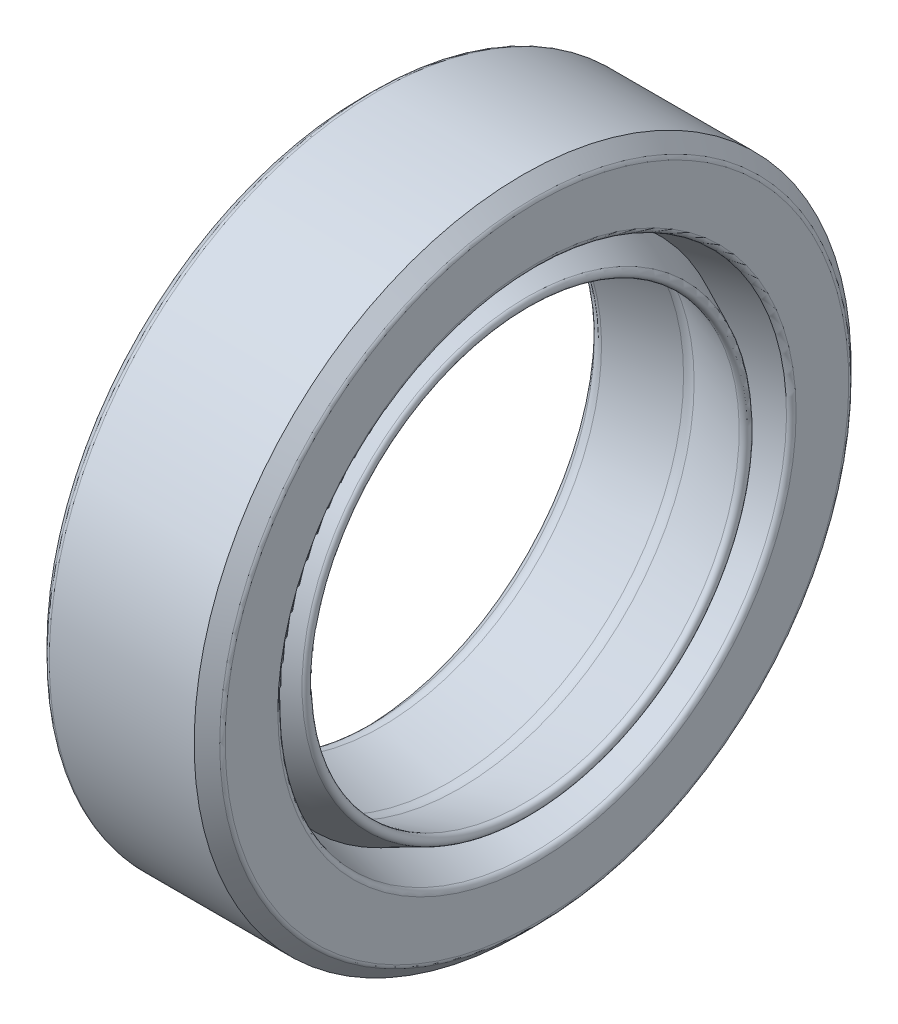
ISO-10303-21;
HEADER;
FILE_DESCRIPTION(('STEP AP214'),'2;1');
FILE_NAME('part.step','',(''),(''),'','','');
FILE_SCHEMA(('AUTOMOTIVE_DESIGN { 1 0 10303 214 1 1 1 1 }'));
ENDSEC;
DATA;
#1=APPLICATION_CONTEXT('core data for automotive mechanical design processes');
#2=APPLICATION_PROTOCOL_DEFINITION('international standard','automotive_design',2000,#1);
#3=PRODUCT_CONTEXT('',#1,'mechanical');
#4=PRODUCT('Part','Part','',(#3));
#5=PRODUCT_RELATED_PRODUCT_CATEGORY('part','',(#4));
#6=PRODUCT_DEFINITION_FORMATION('','',#4);
#7=PRODUCT_DEFINITION_CONTEXT('part definition',#1,'design');
#8=PRODUCT_DEFINITION('design','',#6,#7);
#9=PRODUCT_DEFINITION_SHAPE('','',#8);
#10=(LENGTH_UNIT() NAMED_UNIT(*) SI_UNIT(.MILLI.,.METRE.));
#11=(NAMED_UNIT(*) PLANE_ANGLE_UNIT() SI_UNIT($,.RADIAN.));
#12=(NAMED_UNIT(*) SI_UNIT($,.STERADIAN.) SOLID_ANGLE_UNIT());
#13=UNCERTAINTY_MEASURE_WITH_UNIT(LENGTH_MEASURE(1.E-05),#10,'distance_accuracy_value','');
#14=(GEOMETRIC_REPRESENTATION_CONTEXT(3) GLOBAL_UNCERTAINTY_ASSIGNED_CONTEXT((#13)) GLOBAL_UNIT_ASSIGNED_CONTEXT((#10,
#11,#12)) REPRESENTATION_CONTEXT('',''));
#15=CARTESIAN_POINT('',(0.,0.,0.));
#16=DIRECTION('',(0.,0.,1.));
#17=DIRECTION('',(1.,0.,0.));
#18=AXIS2_PLACEMENT_3D('',#15,#16,#17);
#19=CARTESIAN_POINT('',(0.282360124010534,0.,0.));
#20=DIRECTION('',(-1.,0.,0.));
#21=DIRECTION('',(0.,-1.,0.));
#22=AXIS2_PLACEMENT_3D('',#19,#20,#21);
#23=CONICAL_SURFACE('',#22,10.2714308450373,0.433843204837225);
#24=CARTESIAN_POINT('',(-1.56003271260863,0.,0.));
#25=DIRECTION('',(1.,0.,0.));
#26=DIRECTION('',(0.,1.,0.));
#27=AXIS2_PLACEMENT_3D('',#24,#25,#26);
#28=CIRCLE('',#27,11.1249761059022);
#29=CARTESIAN_POINT('',(-1.56003271260863,11.1249761059022,0.));
#30=VERTEX_POINT('',#29);
#31=EDGE_CURVE('E10',#30,#30,#28,.T.);
#32=ORIENTED_EDGE('',*,*,#31,.T.);
#33=EDGE_LOOP('',(#32));
#34=FACE_BOUND('',#33,.T.);
#35=CARTESIAN_POINT('',(0.282360124010534,0.,0.));
#36=DIRECTION('',(1.,0.,0.));
#37=DIRECTION('',(0.,1.,0.));
#38=AXIS2_PLACEMENT_3D('',#35,#36,#37);
#39=CIRCLE('',#38,10.2714308450373);
#40=CARTESIAN_POINT('',(0.282360124010533,10.2714308450373,0.));
#41=VERTEX_POINT('',#40);
#42=EDGE_CURVE('E112',#41,#41,#39,.T.);
#43=ORIENTED_EDGE('',*,*,#42,.F.);
#44=EDGE_LOOP('',(#43));
#45=FACE_BOUND('',#44,.T.);
#46=ADVANCED_FACE('F30',(#34,#45),#23,.T.);
#47=CARTESIAN_POINT('',(-1.56003271260863,0.,0.));
#48=DIRECTION('',(1.,0.,0.));
#49=DIRECTION('',(0.,1.,0.));
#50=AXIS2_PLACEMENT_3D('',#47,#48,#49);
#51=CONICAL_SURFACE('',#50,11.1249761059022,0.218099471078963);
#52=CARTESIAN_POINT('',(0.545582679624154,0.,0.));
#53=DIRECTION('',(1.,0.,0.));
#54=DIRECTION('',(0.,1.,0.));
#55=AXIS2_PLACEMENT_3D('',#52,#53,#54);
#56=CIRCLE('',#55,11.5916324871359);
#57=CARTESIAN_POINT('',(0.545582679624152,11.5916324871359,0.));
#58=VERTEX_POINT('',#57);
#59=EDGE_CURVE('E36',#58,#58,#56,.T.);
#60=ORIENTED_EDGE('',*,*,#59,.T.);
#61=EDGE_LOOP('',(#60));
#62=FACE_BOUND('',#61,.T.);
#63=ORIENTED_EDGE('',*,*,#31,.F.);
#64=EDGE_LOOP('',(#63));
#65=FACE_BOUND('',#64,.T.);
#66=ADVANCED_FACE('F120',(#62,#65),#51,.F.);
#67=CARTESIAN_POINT('',(0.491489052437329,0.,0.));
#68=DIRECTION('',(1.,0.,0.));
#69=DIRECTION('',(0.,1.,0.));
#70=AXIS2_PLACEMENT_3D('',#67,#68,#69);
#71=TOROIDAL_SURFACE('',#70,11.8357100967149,0.25);
#72=CARTESIAN_POINT('',(0.741489052437329,0.,0.));
#73=DIRECTION('',(1.,0.,0.));
#74=DIRECTION('',(0.,1.,0.));
#75=AXIS2_PLACEMENT_3D('',#72,#73,#74);
#76=CIRCLE('',#75,11.8357100967149);
#77=CARTESIAN_POINT('',(0.741489052437328,11.8357100967149,0.));
#78=VERTEX_POINT('',#77);
#79=EDGE_CURVE('E40',#78,#78,#76,.T.);
#80=ORIENTED_EDGE('',*,*,#79,.T.);
#81=EDGE_LOOP('',(#80));
#82=FACE_BOUND('',#81,.T.);
#83=ORIENTED_EDGE('',*,*,#59,.F.);
#84=EDGE_LOOP('',(#83));
#85=FACE_BOUND('',#84,.T.);
#86=ADVANCED_FACE('F124',(#82,#85),#71,.T.);
#87=CARTESIAN_POINT('',(0.741489052437327,14.238846035536,0.));
#88=DIRECTION('',(1.,0.,0.));
#89=DIRECTION('',(0.,1.,0.));
#90=AXIS2_PLACEMENT_3D('',#87,#88,#89);
#91=PLANE('',#90);
#92=CARTESIAN_POINT('',(0.741489052437328,0.,0.));
#93=DIRECTION('',(1.,0.,0.));
#94=DIRECTION('',(0.,1.,0.));
#95=AXIS2_PLACEMENT_3D('',#92,#93,#94);
#96=CIRCLE('',#95,14.238846035536);
#97=CARTESIAN_POINT('',(0.741489052437326,14.238846035536,0.));
#98=VERTEX_POINT('',#97);
#99=EDGE_CURVE('E44',#98,#98,#96,.T.);
#100=ORIENTED_EDGE('',*,*,#99,.T.);
#101=EDGE_LOOP('',(#100));
#102=FACE_BOUND('',#101,.T.);
#103=ORIENTED_EDGE('',*,*,#79,.F.);
#104=EDGE_LOOP('',(#103));
#105=FACE_BOUND('',#104,.T.);
#106=ADVANCED_FACE('F128',(#102,#105),#91,.T.);
#107=CARTESIAN_POINT('',(0.491489052437328,0.,0.));
#108=DIRECTION('',(1.,0.,0.));
#109=DIRECTION('',(0.,1.,0.));
#110=AXIS2_PLACEMENT_3D('',#107,#108,#109);
#111=TOROIDAL_SURFACE('',#110,14.238846035536,0.25);
#112=CARTESIAN_POINT('',(0.668265747733963,0.,0.));
#113=DIRECTION('',(1.,0.,0.));
#114=DIRECTION('',(0.,1.,0.));
#115=AXIS2_PLACEMENT_3D('',#112,#113,#114);
#116=CIRCLE('',#115,14.4156227308326);
#117=CARTESIAN_POINT('',(0.668265747733962,14.4156227308326,0.));
#118=VERTEX_POINT('',#117);
#119=EDGE_CURVE('E49',#118,#118,#116,.T.);
#120=ORIENTED_EDGE('',*,*,#119,.T.);
#121=EDGE_LOOP('',(#120));
#122=FACE_BOUND('',#121,.T.);
#123=ORIENTED_EDGE('',*,*,#99,.F.);
#124=EDGE_LOOP('',(#123));
#125=FACE_BOUND('',#124,.T.);
#126=ADVANCED_FACE('F135',(#122,#125),#111,.T.);
#127=CARTESIAN_POINT('',(0.668265747733963,0.,0.));
#128=DIRECTION('',(-1.,0.,0.));
#129=DIRECTION('',(0.,-1.,0.));
#130=AXIS2_PLACEMENT_3D('',#127,#128,#129);
#131=CONICAL_SURFACE('',#130,14.4156227308326,0.785398163397447);
#132=CARTESIAN_POINT('',(0.0838884785665713,0.,0.));
#133=DIRECTION('',(1.,0.,0.));
#134=DIRECTION('',(0.,1.,0.));
#135=AXIS2_PLACEMENT_3D('',#132,#133,#134);
#136=CIRCLE('',#135,15.);
#137=CARTESIAN_POINT('',(0.0838884785665695,15.,0.));
#138=VERTEX_POINT('',#137);
#139=EDGE_CURVE('E52',#138,#138,#136,.T.);
#140=ORIENTED_EDGE('',*,*,#139,.T.);
#141=EDGE_LOOP('',(#140));
#142=FACE_BOUND('',#141,.T.);
#143=ORIENTED_EDGE('',*,*,#119,.F.);
#144=EDGE_LOOP('',(#143));
#145=FACE_BOUND('',#144,.T.);
#146=ADVANCED_FACE('F139',(#142,#145),#131,.T.);
#147=CARTESIAN_POINT('',(0.,0.,0.));
#148=DIRECTION('',(1.,0.,0.));
#149=DIRECTION('',(0.,1.,0.));
#150=AXIS2_PLACEMENT_3D('',#147,#148,#149);
#151=CYLINDRICAL_SURFACE('',#150,15.);
#152=CARTESIAN_POINT('',(-6.53252049436465,0.,0.));
#153=DIRECTION('',(1.,0.,0.));
#154=DIRECTION('',(0.,1.,0.));
#155=AXIS2_PLACEMENT_3D('',#152,#153,#154);
#156=CIRCLE('',#155,15.);
#157=CARTESIAN_POINT('',(-6.53252049436465,15.,0.));
#158=VERTEX_POINT('',#157);
#159=EDGE_CURVE('E55',#158,#158,#156,.T.);
#160=ORIENTED_EDGE('',*,*,#159,.T.);
#161=EDGE_LOOP('',(#160));
#162=FACE_BOUND('',#161,.T.);
#163=ORIENTED_EDGE('',*,*,#139,.F.);
#164=EDGE_LOOP('',(#163));
#165=FACE_BOUND('',#164,.T.);
#166=ADVANCED_FACE('F143',(#162,#165),#151,.T.);
#167=CARTESIAN_POINT('',(-6.53252049436465,0.,0.));
#168=DIRECTION('',(1.,0.,0.));
#169=DIRECTION('',(0.,1.,0.));
#170=AXIS2_PLACEMENT_3D('',#167,#168,#169);
#171=TOROIDAL_SURFACE('',#170,14.75,0.25);
#172=CARTESIAN_POINT('',(-6.70929718966128,0.,0.));
#173=DIRECTION('',(1.,0.,0.));
#174=DIRECTION('',(0.,1.,0.));
#175=AXIS2_PLACEMENT_3D('',#172,#173,#174);
#176=CIRCLE('',#175,14.9267766952966);
#177=CARTESIAN_POINT('',(-6.70929718966129,14.9267766952966,0.));
#178=VERTEX_POINT('',#177);
#179=EDGE_CURVE('E58',#178,#178,#176,.T.);
#180=ORIENTED_EDGE('',*,*,#179,.T.);
#181=EDGE_LOOP('',(#180));
#182=FACE_BOUND('',#181,.T.);
#183=ORIENTED_EDGE('',*,*,#159,.F.);
#184=EDGE_LOOP('',(#183));
#185=FACE_BOUND('',#184,.T.);
#186=ADVANCED_FACE('F147',(#182,#185),#171,.T.);
#187=CARTESIAN_POINT('',(-6.70929718966128,0.,0.));
#188=DIRECTION('',(1.,0.,0.));
#189=DIRECTION('',(0.,1.,0.));
#190=AXIS2_PLACEMENT_3D('',#187,#188,#189);
#191=CONICAL_SURFACE('',#190,14.9267766952966,0.785398163397448);
#192=CARTESIAN_POINT('',(-7.18528764285931,0.,0.));
#193=DIRECTION('',(1.,0.,0.));
#194=DIRECTION('',(0.,1.,0.));
#195=AXIS2_PLACEMENT_3D('',#192,#193,#194);
#196=CIRCLE('',#195,14.4507862420986);
#197=CARTESIAN_POINT('',(-7.18528764285931,14.4507862420986,0.));
#198=VERTEX_POINT('',#197);
#199=EDGE_CURVE('E61',#198,#198,#196,.T.);
#200=ORIENTED_EDGE('',*,*,#199,.T.);
#201=EDGE_LOOP('',(#200));
#202=FACE_BOUND('',#201,.T.);
#203=ORIENTED_EDGE('',*,*,#179,.F.);
#204=EDGE_LOOP('',(#203));
#205=FACE_BOUND('',#204,.T.);
#206=ADVANCED_FACE('F151',(#202,#205),#191,.T.);
#207=CARTESIAN_POINT('',(-7.00851094756267,0.,0.));
#208=DIRECTION('',(1.,0.,0.));
#209=DIRECTION('',(0.,1.,0.));
#210=AXIS2_PLACEMENT_3D('',#207,#208,#209);
#211=TOROIDAL_SURFACE('',#210,14.274009546802,0.250000000000001);
#212=CARTESIAN_POINT('',(-7.25851094756267,0.,0.));
#213=DIRECTION('',(1.,0.,0.));
#214=DIRECTION('',(0.,1.,0.));
#215=AXIS2_PLACEMENT_3D('',#212,#213,#214);
#216=CIRCLE('',#215,14.274009546802);
#217=CARTESIAN_POINT('',(-7.25851094756267,14.274009546802,0.));
#218=VERTEX_POINT('',#217);
#219=EDGE_CURVE('E64',#218,#218,#216,.T.);
#220=ORIENTED_EDGE('',*,*,#219,.T.);
#221=EDGE_LOOP('',(#220));
#222=FACE_BOUND('',#221,.T.);
#223=ORIENTED_EDGE('',*,*,#199,.F.);
#224=EDGE_LOOP('',(#223));
#225=FACE_BOUND('',#224,.T.);
#226=ADVANCED_FACE('F155',(#222,#225),#211,.T.);
#227=CARTESIAN_POINT('',(-7.25851094756267,12.8444503254183,0.));
#228=DIRECTION('',(-1.,0.,0.));
#229=DIRECTION('',(0.,-1.,0.));
#230=AXIS2_PLACEMENT_3D('',#227,#228,#229);
#231=PLANE('',#230);
#232=CARTESIAN_POINT('',(-7.25851094756267,0.,0.));
#233=DIRECTION('',(1.,0.,0.));
#234=DIRECTION('',(0.,1.,0.));
#235=AXIS2_PLACEMENT_3D('',#232,#233,#234);
#236=CIRCLE('',#235,12.8444503254183);
#237=CARTESIAN_POINT('',(-7.25851094756267,12.8444503254183,0.));
#238=VERTEX_POINT('',#237);
#239=EDGE_CURVE('E67',#238,#238,#236,.T.);
#240=ORIENTED_EDGE('',*,*,#239,.T.);
#241=EDGE_LOOP('',(#240));
#242=FACE_BOUND('',#241,.T.);
#243=ORIENTED_EDGE('',*,*,#219,.F.);
#244=EDGE_LOOP('',(#243));
#245=FACE_BOUND('',#244,.T.);
#246=ADVANCED_FACE('F159',(#242,#245),#231,.T.);
#247=CARTESIAN_POINT('',(-7.00851094756267,0.,0.));
#248=DIRECTION('',(1.,0.,0.));
#249=DIRECTION('',(0.,1.,0.));
#250=AXIS2_PLACEMENT_3D('',#247,#248,#249);
#251=TOROIDAL_SURFACE('',#250,12.8444503254183,0.25);
#252=CARTESIAN_POINT('',(-7.18528764285931,0.,0.));
#253=DIRECTION('',(1.,0.,0.));
#254=DIRECTION('',(0.,1.,0.));
#255=AXIS2_PLACEMENT_3D('',#252,#253,#254);
#256=CIRCLE('',#255,12.6676736301216);
#257=CARTESIAN_POINT('',(-7.18528764285931,12.6676736301216,0.));
#258=VERTEX_POINT('',#257);
#259=EDGE_CURVE('E70',#258,#258,#256,.T.);
#260=ORIENTED_EDGE('',*,*,#259,.T.);
#261=EDGE_LOOP('',(#260));
#262=FACE_BOUND('',#261,.T.);
#263=ORIENTED_EDGE('',*,*,#239,.F.);
#264=EDGE_LOOP('',(#263));
#265=FACE_BOUND('',#264,.T.);
#266=ADVANCED_FACE('F163',(#262,#265),#251,.T.);
#267=CARTESIAN_POINT('',(-7.18528764285931,0.,0.));
#268=DIRECTION('',(-1.,0.,0.));
#269=DIRECTION('',(0.,-1.,0.));
#270=AXIS2_PLACEMENT_3D('',#267,#268,#269);
#271=CONICAL_SURFACE('',#270,12.6676736301216,0.785398163397448);
#272=CARTESIAN_POINT('',(-6.84993887575632,0.,0.));
#273=DIRECTION('',(1.,0.,0.));
#274=DIRECTION('',(0.,1.,0.));
#275=AXIS2_PLACEMENT_3D('',#272,#273,#274);
#276=CIRCLE('',#275,12.3323248630186);
#277=CARTESIAN_POINT('',(-6.84993887575632,12.3323248630186,0.));
#278=VERTEX_POINT('',#277);
#279=EDGE_CURVE('E73',#278,#278,#276,.T.);
#280=ORIENTED_EDGE('',*,*,#279,.T.);
#281=EDGE_LOOP('',(#280));
#282=FACE_BOUND('',#281,.T.);
#283=ORIENTED_EDGE('',*,*,#259,.F.);
#284=EDGE_LOOP('',(#283));
#285=FACE_BOUND('',#284,.T.);
#286=ADVANCED_FACE('F167',(#282,#285),#271,.F.);
#287=CARTESIAN_POINT('',(-6.67316218045968,0.,0.));
#288=DIRECTION('',(1.,0.,0.));
#289=DIRECTION('',(0.,1.,0.));
#290=AXIS2_PLACEMENT_3D('',#287,#288,#289);
#291=TOROIDAL_SURFACE('',#290,12.5091015583153,0.25);
#292=CARTESIAN_POINT('',(-6.61698959165721,0.,0.));
#293=DIRECTION('',(1.,0.,0.));
#294=DIRECTION('',(0.,1.,0.));
#295=AXIS2_PLACEMENT_3D('',#292,#293,#294);
#296=CIRCLE('',#295,12.2654940045177);
#297=CARTESIAN_POINT('',(-6.61698959165721,12.2654940045177,0.));
#298=VERTEX_POINT('',#297);
#299=EDGE_CURVE('E76',#298,#298,#296,.T.);
#300=ORIENTED_EDGE('',*,*,#299,.T.);
#301=EDGE_LOOP('',(#300));
#302=FACE_BOUND('',#301,.T.);
#303=ORIENTED_EDGE('',*,*,#279,.F.);
#304=EDGE_LOOP('',(#303));
#305=FACE_BOUND('',#304,.T.);
#306=ADVANCED_FACE('F171',(#302,#305),#291,.T.);
#307=CARTESIAN_POINT('',(-6.61698959165721,0.,0.));
#308=DIRECTION('',(1.,0.,0.));
#309=DIRECTION('',(0.,1.,0.));
#310=AXIS2_PLACEMENT_3D('',#307,#308,#309);
#311=CONICAL_SURFACE('',#310,12.2654940045177,0.226625254426989);
#312=CARTESIAN_POINT('',(-2.13804464969207,0.,0.));
#313=DIRECTION('',(1.,0.,0.));
#314=DIRECTION('',(0.,1.,0.));
#315=AXIS2_PLACEMENT_3D('',#312,#313,#314);
#316=CIRCLE('',#315,13.2982777937388);
#317=CARTESIAN_POINT('',(-2.13804464969208,13.2982777937388,0.));
#318=VERTEX_POINT('',#317);
#319=EDGE_CURVE('E79',#318,#318,#316,.T.);
#320=ORIENTED_EDGE('',*,*,#319,.T.);
#321=EDGE_LOOP('',(#320));
#322=FACE_BOUND('',#321,.T.);
#323=ORIENTED_EDGE('',*,*,#299,.F.);
#324=EDGE_LOOP('',(#323));
#325=FACE_BOUND('',#324,.T.);
#326=ADVANCED_FACE('F175',(#322,#325),#311,.F.);
#327=CARTESIAN_POINT('',(-2.0818720608896,0.,0.));
#328=DIRECTION('',(1.,0.,0.));
#329=DIRECTION('',(0.,1.,0.));
#330=AXIS2_PLACEMENT_3D('',#327,#328,#329);
#331=TOROIDAL_SURFACE('',#330,13.0546702399412,0.25);
#332=CARTESIAN_POINT('',(-1.8318720608896,0.,0.));
#333=DIRECTION('',(1.,0.,0.));
#334=DIRECTION('',(0.,1.,0.));
#335=AXIS2_PLACEMENT_3D('',#332,#333,#334);
#336=CIRCLE('',#335,13.0546702399412);
#337=CARTESIAN_POINT('',(-1.8318720608896,13.0546702399412,0.));
#338=VERTEX_POINT('',#337);
#339=EDGE_CURVE('E82',#338,#338,#336,.T.);
#340=ORIENTED_EDGE('',*,*,#339,.T.);
#341=EDGE_LOOP('',(#340));
#342=FACE_BOUND('',#341,.T.);
#343=ORIENTED_EDGE('',*,*,#319,.F.);
#344=EDGE_LOOP('',(#343));
#345=FACE_BOUND('',#344,.T.);
#346=ADVANCED_FACE('F179',(#342,#345),#331,.F.);
#347=CARTESIAN_POINT('',(-1.8318720608896,13.0546702399412,0.));
#348=DIRECTION('',(-1.,0.,0.));
#349=DIRECTION('',(0.,-1.,0.));
#350=AXIS2_PLACEMENT_3D('',#347,#348,#349);
#351=PLANE('',#350);
#352=CARTESIAN_POINT('',(-1.8318720608896,0.,0.));
#353=DIRECTION('',(1.,0.,0.));
#354=DIRECTION('',(0.,1.,0.));
#355=AXIS2_PLACEMENT_3D('',#352,#353,#354);
#356=CIRCLE('',#355,12.6329639029009);
#357=CARTESIAN_POINT('',(-1.8318720608896,12.6329639029009,0.));
#358=VERTEX_POINT('',#357);
#359=EDGE_CURVE('E85',#358,#358,#356,.T.);
#360=ORIENTED_EDGE('',*,*,#359,.T.);
#361=EDGE_LOOP('',(#360));
#362=FACE_BOUND('',#361,.T.);
#363=ORIENTED_EDGE('',*,*,#339,.F.);
#364=EDGE_LOOP('',(#363));
#365=FACE_BOUND('',#364,.T.);
#366=ADVANCED_FACE('F183',(#362,#365),#351,.T.);
#367=CARTESIAN_POINT('',(-2.0818720608896,0.,0.));
#368=DIRECTION('',(1.,0.,0.));
#369=DIRECTION('',(0.,1.,0.));
#370=AXIS2_PLACEMENT_3D('',#367,#368,#369);
#371=TOROIDAL_SURFACE('',#370,12.6329639029009,0.249999999999999);
#372=CARTESIAN_POINT('',(-2.01893221665568,0.,0.));
#373=DIRECTION('',(1.,0.,0.));
#374=DIRECTION('',(0.,1.,0.));
#375=AXIS2_PLACEMENT_3D('',#372,#373,#374);
#376=CIRCLE('',#375,12.3910164375127);
#377=CARTESIAN_POINT('',(-2.01893221665568,12.3910164375127,0.));
#378=VERTEX_POINT('',#377);
#379=EDGE_CURVE('E88',#378,#378,#376,.T.);
#380=ORIENTED_EDGE('',*,*,#379,.T.);
#381=EDGE_LOOP('',(#380));
#382=FACE_BOUND('',#381,.T.);
#383=ORIENTED_EDGE('',*,*,#359,.F.);
#384=EDGE_LOOP('',(#383));
#385=FACE_BOUND('',#384,.T.);
#386=ADVANCED_FACE('F187',(#382,#385),#371,.F.);
#387=CARTESIAN_POINT('',(-2.01893221665568,0.,0.));
#388=DIRECTION('',(1.,0.,0.));
#389=DIRECTION('',(0.,1.,0.));
#390=AXIS2_PLACEMENT_3D('',#387,#388,#389);
#391=CONICAL_SURFACE('',#390,12.3910164375127,0.254497759285281);
#392=CARTESIAN_POINT('',(-7.25851094756267,0.,0.));
#393=DIRECTION('',(1.,0.,0.));
#394=DIRECTION('',(0.,1.,0.));
#395=AXIS2_PLACEMENT_3D('',#392,#393,#394);
#396=CIRCLE('',#395,11.0280004263906);
#397=CARTESIAN_POINT('',(-7.25851094756267,11.0280004263906,0.));
#398=VERTEX_POINT('',#397);
#399=EDGE_CURVE('E91',#398,#398,#396,.T.);
#400=ORIENTED_EDGE('',*,*,#399,.T.);
#401=EDGE_LOOP('',(#400));
#402=FACE_BOUND('',#401,.T.);
#403=ORIENTED_EDGE('',*,*,#379,.F.);
#404=EDGE_LOOP('',(#403));
#405=FACE_BOUND('',#404,.T.);
#406=ADVANCED_FACE('F191',(#402,#405),#391,.T.);
#407=CARTESIAN_POINT('',(-7.25851094756267,10.6224370626047,0.));
#408=DIRECTION('',(-1.,0.,0.));
#409=DIRECTION('',(0.,-1.,0.));
#410=AXIS2_PLACEMENT_3D('',#407,#408,#409);
#411=PLANE('',#410);
#412=CARTESIAN_POINT('',(-7.25851094756267,0.,0.));
#413=DIRECTION('',(1.,0.,0.));
#414=DIRECTION('',(0.,1.,0.));
#415=AXIS2_PLACEMENT_3D('',#412,#413,#414);
#416=CIRCLE('',#415,10.6224370626048);
#417=CARTESIAN_POINT('',(-7.25851094756267,10.6224370626047,0.));
#418=VERTEX_POINT('',#417);
#419=EDGE_CURVE('E94',#418,#418,#416,.T.);
#420=ORIENTED_EDGE('',*,*,#419,.T.);
#421=EDGE_LOOP('',(#420));
#422=FACE_BOUND('',#421,.T.);
#423=ORIENTED_EDGE('',*,*,#399,.F.);
#424=EDGE_LOOP('',(#423));
#425=FACE_BOUND('',#424,.T.);
#426=ADVANCED_FACE('F195',(#422,#425),#411,.T.);
#427=CARTESIAN_POINT('',(-7.25851094756267,0.,0.));
#428=DIRECTION('',(-1.,0.,0.));
#429=DIRECTION('',(0.,-1.,0.));
#430=AXIS2_PLACEMENT_3D('',#427,#428,#429);
#431=CONICAL_SURFACE('',#430,10.6224370626048,0.785398163397447);
#432=CARTESIAN_POINT('',(-6.83002458085379,0.,0.));
#433=DIRECTION('',(1.,0.,0.));
#434=DIRECTION('',(0.,1.,0.));
#435=AXIS2_PLACEMENT_3D('',#432,#433,#434);
#436=CIRCLE('',#435,10.1939506958959);
#437=CARTESIAN_POINT('',(-6.83002458085379,10.1939506958959,0.));
#438=VERTEX_POINT('',#437);
#439=EDGE_CURVE('E97',#438,#438,#436,.T.);
#440=ORIENTED_EDGE('',*,*,#439,.T.);
#441=EDGE_LOOP('',(#440));
#442=FACE_BOUND('',#441,.T.);
#443=ORIENTED_EDGE('',*,*,#419,.F.);
#444=EDGE_LOOP('',(#443));
#445=FACE_BOUND('',#444,.T.);
#446=ADVANCED_FACE('F199',(#442,#445),#431,.F.);
#447=CARTESIAN_POINT('',(-6.47647119026052,0.,0.));
#448=DIRECTION('',(1.,0.,0.));
#449=DIRECTION('',(0.,1.,0.));
#450=AXIS2_PLACEMENT_3D('',#447,#448,#449);
#451=TOROIDAL_SURFACE('',#450,10.5475040864891,0.5);
#452=CARTESIAN_POINT('',(-6.36828393588686,0.,0.));
#453=DIRECTION('',(1.,0.,0.));
#454=DIRECTION('',(0.,1.,0.));
#455=AXIS2_PLACEMENT_3D('',#452,#453,#454);
#456=CIRCLE('',#455,10.0593488673312);
#457=CARTESIAN_POINT('',(-6.36828393588686,10.0593488673312,0.));
#458=VERTEX_POINT('',#457);
#459=EDGE_CURVE('E100',#458,#458,#456,.T.);
#460=ORIENTED_EDGE('',*,*,#459,.T.);
#461=EDGE_LOOP('',(#460));
#462=FACE_BOUND('',#461,.T.);
#463=ORIENTED_EDGE('',*,*,#439,.F.);
#464=EDGE_LOOP('',(#463));
#465=FACE_BOUND('',#464,.T.);
#466=ADVANCED_FACE('F203',(#462,#465),#451,.T.);
#467=CARTESIAN_POINT('',(-6.36828393588686,0.,0.));
#468=DIRECTION('',(1.,0.,0.));
#469=DIRECTION('',(0.,1.,0.));
#470=AXIS2_PLACEMENT_3D('',#467,#468,#469);
#471=CONICAL_SURFACE('',#470,10.0593488673312,0.218099471078964);
#472=CARTESIAN_POINT('',(-3.30181555235555,0.,0.));
#473=DIRECTION('',(1.,0.,0.));
#474=DIRECTION('',(0.,1.,0.));
#475=AXIS2_PLACEMENT_3D('',#472,#473,#474);
#476=CIRCLE('',#475,10.7389540052424);
#477=CARTESIAN_POINT('',(-3.30181555235555,10.7389540052424,0.));
#478=VERTEX_POINT('',#477);
#479=EDGE_CURVE('E103',#478,#478,#476,.T.);
#480=ORIENTED_EDGE('',*,*,#479,.T.);
#481=EDGE_LOOP('',(#480));
#482=FACE_BOUND('',#481,.T.);
#483=ORIENTED_EDGE('',*,*,#459,.F.);
#484=EDGE_LOOP('',(#483));
#485=FACE_BOUND('',#484,.T.);
#486=ADVANCED_FACE('F207',(#482,#485),#471,.F.);
#487=CARTESIAN_POINT('',(-3.08544104360824,0.,0.));
#488=DIRECTION('',(1.,0.,0.));
#489=DIRECTION('',(0.,1.,0.));
#490=AXIS2_PLACEMENT_3D('',#487,#488,#489);
#491=TOROIDAL_SURFACE('',#490,9.76264356692665,1.);
#492=CARTESIAN_POINT('',(-2.80087674893342,0.,0.));
#493=DIRECTION('',(1.,0.,0.));
#494=DIRECTION('',(0.,1.,0.));
#495=AXIS2_PLACEMENT_3D('',#492,#493,#494);
#496=CIRCLE('',#495,10.7213005244439);
#497=CARTESIAN_POINT('',(-2.80087674893342,10.7213005244439,0.));
#498=VERTEX_POINT('',#497);
#499=EDGE_CURVE('E106',#498,#498,#496,.T.);
#500=ORIENTED_EDGE('',*,*,#499,.T.);
#501=EDGE_LOOP('',(#500));
#502=FACE_BOUND('',#501,.T.);
#503=ORIENTED_EDGE('',*,*,#479,.F.);
#504=EDGE_LOOP('',(#503));
#505=FACE_BOUND('',#504,.T.);
#506=ADVANCED_FACE('F211',(#502,#505),#491,.F.);
#507=CARTESIAN_POINT('',(-2.80087674893342,0.,0.));
#508=DIRECTION('',(-1.,0.,0.));
#509=DIRECTION('',(0.,-1.,0.));
#510=AXIS2_PLACEMENT_3D('',#507,#508,#509);
#511=CONICAL_SURFACE('',#510,10.7213005244439,0.28855190194134);
#512=CARTESIAN_POINT('',(0.12429082683124,0.,0.));
#513=DIRECTION('',(1.,0.,0.));
#514=DIRECTION('',(0.,1.,0.));
#515=AXIS2_PLACEMENT_3D('',#512,#513,#514);
#516=CIRCLE('',#515,9.85300426739811);
#517=CARTESIAN_POINT('',(0.124290826831239,9.85300426739811,0.));
#518=VERTEX_POINT('',#517);
#519=EDGE_CURVE('E109',#518,#518,#516,.T.);
#520=ORIENTED_EDGE('',*,*,#519,.T.);
#521=EDGE_LOOP('',(#520));
#522=FACE_BOUND('',#521,.T.);
#523=ORIENTED_EDGE('',*,*,#499,.F.);
#524=EDGE_LOOP('',(#523));
#525=FACE_BOUND('',#524,.T.);
#526=ADVANCED_FACE('F215',(#522,#525),#511,.F.);
#527=CARTESIAN_POINT('',(0.188100247176085,0.,0.));
#528=DIRECTION('',(1.,0.,0.));
#529=DIRECTION('',(0.,1.,0.));
#530=AXIS2_PLACEMENT_3D('',#527,#528,#529);
#531=TOROIDAL_SURFACE('',#530,10.0679692012055,0.224235512110759);
#532=ORIENTED_EDGE('',*,*,#42,.T.);
#533=EDGE_LOOP('',(#532));
#534=FACE_BOUND('',#533,.T.);
#535=ORIENTED_EDGE('',*,*,#519,.F.);
#536=EDGE_LOOP('',(#535));
#537=FACE_BOUND('',#536,.T.);
#538=ADVANCED_FACE('F116',(#534,#537),#531,.T.);
#539=CLOSED_SHELL('',(#46,#66,#86,#106,#126,#146,#166,#186,#206,#226,#246,#266,#286,#306,#326,
#346,#366,#386,#406,#426,#446,#466,#486,#506,#526,#538));
#540=MANIFOLD_SOLID_BREP('B2',#539);
#541=ADVANCED_BREP_SHAPE_REPRESENTATION('',(#18,#540),#14);
#542=SHAPE_DEFINITION_REPRESENTATION(#9,#541);
ENDSEC;
END-ISO-10303-21;
